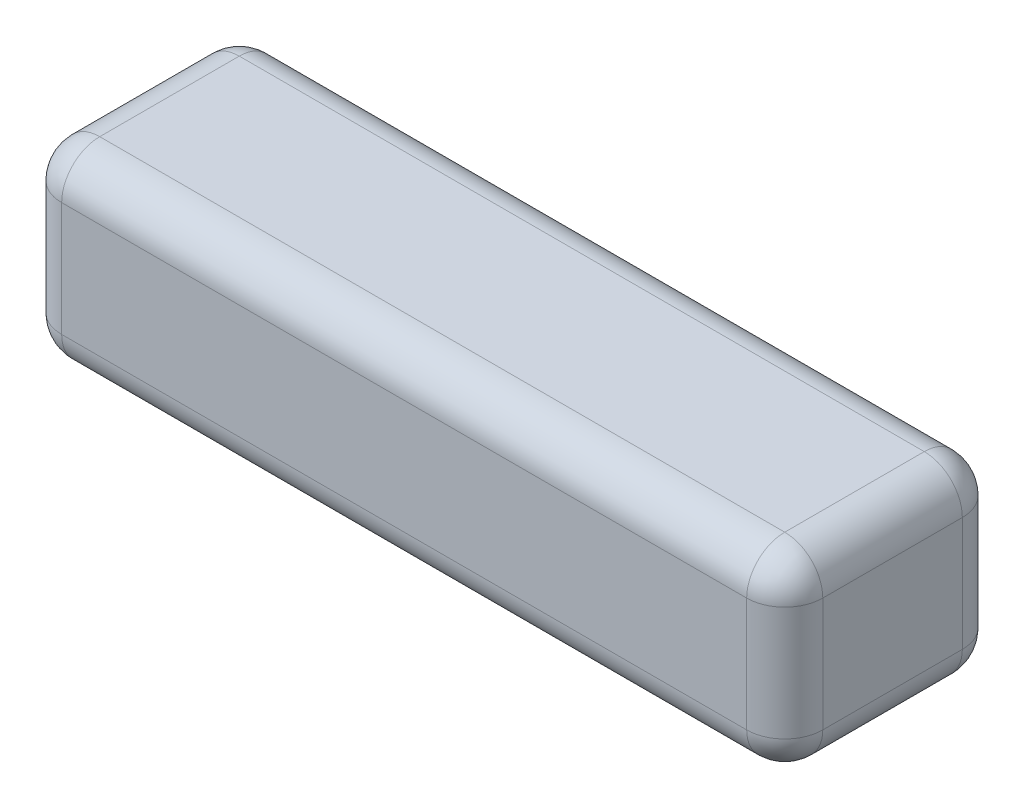
ISO-10303-21;
HEADER;
FILE_DESCRIPTION(('STEP AP214'),'2;1');
FILE_NAME('part.step','',(''),(''),'','','');
FILE_SCHEMA(('AUTOMOTIVE_DESIGN { 1 0 10303 214 1 1 1 1 }'));
ENDSEC;
DATA;
#1=APPLICATION_CONTEXT('core data for automotive mechanical design processes');
#2=APPLICATION_PROTOCOL_DEFINITION('international standard','automotive_design',2000,#1);
#3=PRODUCT_CONTEXT('',#1,'mechanical');
#4=PRODUCT('Part','Part','',(#3));
#5=PRODUCT_RELATED_PRODUCT_CATEGORY('part','',(#4));
#6=PRODUCT_DEFINITION_FORMATION('','',#4);
#7=PRODUCT_DEFINITION_CONTEXT('part definition',#1,'design');
#8=PRODUCT_DEFINITION('design','',#6,#7);
#9=PRODUCT_DEFINITION_SHAPE('','',#8);
#10=(LENGTH_UNIT() NAMED_UNIT(*) SI_UNIT(.MILLI.,.METRE.));
#11=(NAMED_UNIT(*) PLANE_ANGLE_UNIT() SI_UNIT($,.RADIAN.));
#12=(NAMED_UNIT(*) SI_UNIT($,.STERADIAN.) SOLID_ANGLE_UNIT());
#13=UNCERTAINTY_MEASURE_WITH_UNIT(LENGTH_MEASURE(1.E-05),#10,'distance_accuracy_value','');
#14=(GEOMETRIC_REPRESENTATION_CONTEXT(3) GLOBAL_UNCERTAINTY_ASSIGNED_CONTEXT((#13)) GLOBAL_UNIT_ASSIGNED_CONTEXT((#10,
#11,#12)) REPRESENTATION_CONTEXT('',''));
#15=CARTESIAN_POINT('',(0.,0.,0.));
#16=DIRECTION('',(0.,0.,1.));
#17=DIRECTION('',(1.,0.,0.));
#18=AXIS2_PLACEMENT_3D('',#15,#16,#17);
#19=CARTESIAN_POINT('',(30.,15.,-8.5));
#20=DIRECTION('',(-1.,0.,0.));
#21=DIRECTION('',(0.,0.,1.));
#22=AXIS2_PLACEMENT_3D('',#19,#20,#21);
#23=PLANE('',#22);
#24=DIRECTION('',(0.,0.,-1.));
#25=VECTOR('',#24,1.);
#26=CARTESIAN_POINT('',(30.,3.,-8.5));
#27=LINE('',#26,#25);
#28=CARTESIAN_POINT('',(30.,3.,5.5));
#29=VERTEX_POINT('',#28);
#30=CARTESIAN_POINT('',(30.,3.,-5.5));
#31=VERTEX_POINT('',#30);
#32=EDGE_CURVE('E187',#29,#31,#27,.T.);
#33=ORIENTED_EDGE('',*,*,#32,.T.);
#34=DIRECTION('',(0.,-1.,0.));
#35=VECTOR('',#34,1.);
#36=CARTESIAN_POINT('',(30.,15.,-5.5));
#37=LINE('',#36,#35);
#38=CARTESIAN_POINT('',(30.,12.,-5.5));
#39=VERTEX_POINT('',#38);
#40=EDGE_CURVE('E194',#31,#39,#37,.F.);
#41=ORIENTED_EDGE('',*,*,#40,.T.);
#42=DIRECTION('',(0.,0.,-1.));
#43=VECTOR('',#42,1.);
#44=CARTESIAN_POINT('',(30.,12.,8.5));
#45=LINE('',#44,#43);
#46=CARTESIAN_POINT('',(30.,12.,5.5));
#47=VERTEX_POINT('',#46);
#48=EDGE_CURVE('E190',#39,#47,#45,.F.);
#49=ORIENTED_EDGE('',*,*,#48,.T.);
#50=DIRECTION('',(0.,-1.,0.));
#51=VECTOR('',#50,1.);
#52=CARTESIAN_POINT('',(30.,15.,5.5));
#53=LINE('',#52,#51);
#54=EDGE_CURVE('E184',#47,#29,#53,.T.);
#55=ORIENTED_EDGE('',*,*,#54,.T.);
#56=EDGE_LOOP('',(#33,#41,#49,#55));
#57=FACE_BOUND('',#56,.T.);
#58=ADVANCED_FACE('F39',(#57),#23,.F.);
#59=CARTESIAN_POINT('',(-30.,15.,-8.5));
#60=DIRECTION('',(0.,0.,1.));
#61=DIRECTION('',(1.,0.,0.));
#62=AXIS2_PLACEMENT_3D('',#59,#60,#61);
#63=PLANE('',#62);
#64=DIRECTION('',(-1.,0.,0.));
#65=VECTOR('',#64,1.);
#66=CARTESIAN_POINT('',(30.,12.,-8.5));
#67=LINE('',#66,#65);
#68=CARTESIAN_POINT('',(-27.,12.,-8.5));
#69=VERTEX_POINT('',#68);
#70=CARTESIAN_POINT('',(27.,12.,-8.5));
#71=VERTEX_POINT('',#70);
#72=EDGE_CURVE('E213',#69,#71,#67,.F.);
#73=ORIENTED_EDGE('',*,*,#72,.T.);
#74=DIRECTION('',(0.,-1.,0.));
#75=VECTOR('',#74,1.);
#76=CARTESIAN_POINT('',(27.,15.,-8.5));
#77=LINE('',#76,#75);
#78=CARTESIAN_POINT('',(27.,3.,-8.5));
#79=VERTEX_POINT('',#78);
#80=EDGE_CURVE('E220',#71,#79,#77,.T.);
#81=ORIENTED_EDGE('',*,*,#80,.T.);
#82=DIRECTION('',(-1.,0.,0.));
#83=VECTOR('',#82,1.);
#84=CARTESIAN_POINT('',(-30.,3.,-8.5));
#85=LINE('',#84,#83);
#86=CARTESIAN_POINT('',(-27.,3.,-8.5));
#87=VERTEX_POINT('',#86);
#88=EDGE_CURVE('E216',#79,#87,#85,.T.);
#89=ORIENTED_EDGE('',*,*,#88,.T.);
#90=DIRECTION('',(0.,-1.,0.));
#91=VECTOR('',#90,1.);
#92=CARTESIAN_POINT('',(-27.,15.,-8.5));
#93=LINE('',#92,#91);
#94=EDGE_CURVE('E210',#87,#69,#93,.F.);
#95=ORIENTED_EDGE('',*,*,#94,.T.);
#96=EDGE_LOOP('',(#73,#81,#89,#95));
#97=FACE_BOUND('',#96,.T.);
#98=ADVANCED_FACE('F325',(#97),#63,.F.);
#99=CARTESIAN_POINT('',(-30.,15.,-8.5));
#100=DIRECTION('',(1.,0.,0.));
#101=DIRECTION('',(0.,0.,-1.));
#102=AXIS2_PLACEMENT_3D('',#99,#100,#101);
#103=PLANE('',#102);
#104=DIRECTION('',(0.,0.,1.));
#105=VECTOR('',#104,1.);
#106=CARTESIAN_POINT('',(-30.,3.,-8.5));
#107=LINE('',#106,#105);
#108=CARTESIAN_POINT('',(-30.,3.,-5.5));
#109=VERTEX_POINT('',#108);
#110=CARTESIAN_POINT('',(-30.,3.,5.5));
#111=VERTEX_POINT('',#110);
#112=EDGE_CURVE('E176',#109,#111,#107,.T.);
#113=ORIENTED_EDGE('',*,*,#112,.T.);
#114=DIRECTION('',(0.,-1.,0.));
#115=VECTOR('',#114,1.);
#116=CARTESIAN_POINT('',(-30.,15.,5.5));
#117=LINE('',#116,#115);
#118=CARTESIAN_POINT('',(-30.,12.,5.5));
#119=VERTEX_POINT('',#118);
#120=EDGE_CURVE('E181',#111,#119,#117,.F.);
#121=ORIENTED_EDGE('',*,*,#120,.T.);
#122=DIRECTION('',(0.,0.,1.));
#123=VECTOR('',#122,1.);
#124=CARTESIAN_POINT('',(-30.,12.,-8.5));
#125=LINE('',#124,#123);
#126=CARTESIAN_POINT('',(-30.,12.,-5.5));
#127=VERTEX_POINT('',#126);
#128=EDGE_CURVE('E135',#119,#127,#125,.F.);
#129=ORIENTED_EDGE('',*,*,#128,.T.);
#130=DIRECTION('',(0.,-1.,0.));
#131=VECTOR('',#130,1.);
#132=CARTESIAN_POINT('',(-30.,15.,-5.5));
#133=LINE('',#132,#131);
#134=EDGE_CURVE('E170',#127,#109,#133,.T.);
#135=ORIENTED_EDGE('',*,*,#134,.T.);
#136=EDGE_LOOP('',(#113,#121,#129,#135));
#137=FACE_BOUND('',#136,.T.);
#138=ADVANCED_FACE('F360',(#137),#103,.F.);
#139=CARTESIAN_POINT('',(-30.,15.,8.5));
#140=DIRECTION('',(0.,0.,-1.));
#141=DIRECTION('',(-1.,0.,0.));
#142=AXIS2_PLACEMENT_3D('',#139,#140,#141);
#143=PLANE('',#142);
#144=DIRECTION('',(1.,0.,0.));
#145=VECTOR('',#144,1.);
#146=CARTESIAN_POINT('',(-30.,3.,8.5));
#147=LINE('',#146,#145);
#148=CARTESIAN_POINT('',(-27.,3.,8.5));
#149=VERTEX_POINT('',#148);
#150=CARTESIAN_POINT('',(27.,3.,8.5));
#151=VERTEX_POINT('',#150);
#152=EDGE_CURVE('E49',#149,#151,#147,.T.);
#153=ORIENTED_EDGE('',*,*,#152,.T.);
#154=DIRECTION('',(0.,-1.,0.));
#155=VECTOR('',#154,1.);
#156=CARTESIAN_POINT('',(27.,15.,8.5));
#157=LINE('',#156,#155);
#158=CARTESIAN_POINT('',(27.,12.,8.5));
#159=VERTEX_POINT('',#158);
#160=EDGE_CURVE('E11',#151,#159,#157,.F.);
#161=ORIENTED_EDGE('',*,*,#160,.T.);
#162=DIRECTION('',(1.,0.,0.));
#163=VECTOR('',#162,1.);
#164=CARTESIAN_POINT('',(-30.,12.,8.5));
#165=LINE('',#164,#163);
#166=CARTESIAN_POINT('',(-27.,12.,8.5));
#167=VERTEX_POINT('',#166);
#168=EDGE_CURVE('E226',#159,#167,#165,.F.);
#169=ORIENTED_EDGE('',*,*,#168,.T.);
#170=DIRECTION('',(0.,-1.,0.));
#171=VECTOR('',#170,1.);
#172=CARTESIAN_POINT('',(-27.,15.,8.5));
#173=LINE('',#172,#171);
#174=EDGE_CURVE('E223',#167,#149,#173,.T.);
#175=ORIENTED_EDGE('',*,*,#174,.T.);
#176=EDGE_LOOP('',(#153,#161,#169,#175));
#177=FACE_BOUND('',#176,.T.);
#178=ADVANCED_FACE('F545',(#177),#143,.F.);
#179=CARTESIAN_POINT('',(0.,15.,0.));
#180=DIRECTION('',(0.,1.,0.));
#181=DIRECTION('',(0.,0.,1.));
#182=AXIS2_PLACEMENT_3D('',#179,#180,#181);
#183=PLANE('',#182);
#184=DIRECTION('',(0.,0.,-1.));
#185=VECTOR('',#184,1.);
#186=CARTESIAN_POINT('',(27.,15.,-8.5));
#187=LINE('',#186,#185);
#188=CARTESIAN_POINT('',(27.,15.,5.5));
#189=VERTEX_POINT('',#188);
#190=CARTESIAN_POINT('',(27.,15.,-5.5));
#191=VERTEX_POINT('',#190);
#192=EDGE_CURVE('E160',#189,#191,#187,.T.);
#193=ORIENTED_EDGE('',*,*,#192,.T.);
#194=DIRECTION('',(-1.,0.,0.));
#195=VECTOR('',#194,1.);
#196=CARTESIAN_POINT('',(-30.,15.,-5.5));
#197=LINE('',#196,#195);
#198=CARTESIAN_POINT('',(-27.,15.,-5.5));
#199=VERTEX_POINT('',#198);
#200=EDGE_CURVE('E164',#191,#199,#197,.T.);
#201=ORIENTED_EDGE('',*,*,#200,.T.);
#202=DIRECTION('',(0.,0.,1.));
#203=VECTOR('',#202,1.);
#204=CARTESIAN_POINT('',(-27.,15.,8.5));
#205=LINE('',#204,#203);
#206=CARTESIAN_POINT('',(-27.,15.,5.5));
#207=VERTEX_POINT('',#206);
#208=EDGE_CURVE('E133',#199,#207,#205,.T.);
#209=ORIENTED_EDGE('',*,*,#208,.T.);
#210=DIRECTION('',(1.,0.,0.));
#211=VECTOR('',#210,1.);
#212=CARTESIAN_POINT('',(30.,15.,5.5));
#213=LINE('',#212,#211);
#214=EDGE_CURVE('E153',#207,#189,#213,.T.);
#215=ORIENTED_EDGE('',*,*,#214,.T.);
#216=EDGE_LOOP('',(#193,#201,#209,#215));
#217=FACE_BOUND('',#216,.T.);
#218=ADVANCED_FACE('F162',(#217),#183,.T.);
#219=CARTESIAN_POINT('',(0.,0.,0.));
#220=DIRECTION('',(0.,1.,0.));
#221=DIRECTION('',(0.,0.,1.));
#222=AXIS2_PLACEMENT_3D('',#219,#220,#221);
#223=PLANE('',#222);
#224=DIRECTION('',(-1.,0.,0.));
#225=VECTOR('',#224,1.);
#226=CARTESIAN_POINT('',(0.,0.,-5.5));
#227=LINE('',#226,#225);
#228=CARTESIAN_POINT('',(-27.,0.,-5.5));
#229=VERTEX_POINT('',#228);
#230=CARTESIAN_POINT('',(27.,0.,-5.5));
#231=VERTEX_POINT('',#230);
#232=EDGE_CURVE('E203',#229,#231,#227,.F.);
#233=ORIENTED_EDGE('',*,*,#232,.T.);
#234=DIRECTION('',(0.,0.,-1.));
#235=VECTOR('',#234,1.);
#236=CARTESIAN_POINT('',(27.,0.,0.));
#237=LINE('',#236,#235);
#238=CARTESIAN_POINT('',(27.,0.,5.5));
#239=VERTEX_POINT('',#238);
#240=EDGE_CURVE('E206',#231,#239,#237,.F.);
#241=ORIENTED_EDGE('',*,*,#240,.T.);
#242=DIRECTION('',(1.,0.,0.));
#243=VECTOR('',#242,1.);
#244=CARTESIAN_POINT('',(0.,0.,5.5));
#245=LINE('',#244,#243);
#246=CARTESIAN_POINT('',(-27.,0.,5.5));
#247=VERTEX_POINT('',#246);
#248=EDGE_CURVE('E197',#239,#247,#245,.F.);
#249=ORIENTED_EDGE('',*,*,#248,.T.);
#250=DIRECTION('',(0.,0.,1.));
#251=VECTOR('',#250,1.);
#252=CARTESIAN_POINT('',(-27.,0.,0.));
#253=LINE('',#252,#251);
#254=EDGE_CURVE('E200',#247,#229,#253,.F.);
#255=ORIENTED_EDGE('',*,*,#254,.T.);
#256=EDGE_LOOP('',(#233,#241,#249,#255));
#257=FACE_BOUND('',#256,.T.);
#258=ADVANCED_FACE('F342',(#257),#223,.F.);
#259=CARTESIAN_POINT('',(27.,3.,-8.5));
#260=DIRECTION('',(0.,0.,-1.));
#261=DIRECTION('',(-1.,0.,0.));
#262=AXIS2_PLACEMENT_3D('',#259,#260,#261);
#263=CYLINDRICAL_SURFACE('',#262,3.);
#264=CARTESIAN_POINT('',(27.,3.,-5.5));
#265=DIRECTION('',(0.,0.,-1.));
#266=DIRECTION('',(-1.,0.,0.));
#267=AXIS2_PLACEMENT_3D('',#264,#265,#266);
#268=CIRCLE('',#267,3.);
#269=EDGE_CURVE('E43',#31,#231,#268,.T.);
#270=ORIENTED_EDGE('',*,*,#269,.F.);
#271=ORIENTED_EDGE('',*,*,#32,.F.);
#272=CARTESIAN_POINT('',(27.,3.,5.5));
#273=DIRECTION('',(0.,0.,1.));
#274=DIRECTION('',(1.,0.,0.));
#275=AXIS2_PLACEMENT_3D('',#272,#273,#274);
#276=CIRCLE('',#275,3.);
#277=EDGE_CURVE('E301',#239,#29,#276,.T.);
#278=ORIENTED_EDGE('',*,*,#277,.F.);
#279=ORIENTED_EDGE('',*,*,#240,.F.);
#280=EDGE_LOOP('',(#270,#271,#278,#279));
#281=FACE_BOUND('',#280,.T.);
#282=ADVANCED_FACE('F41',(#281),#263,.T.);
#283=CARTESIAN_POINT('',(27.,3.,-5.5));
#284=DIRECTION('',(0.,-1.,0.));
#285=DIRECTION('',(0.,0.,-1.));
#286=AXIS2_PLACEMENT_3D('',#283,#284,#285);
#287=SPHERICAL_SURFACE('',#286,3.);
#288=CARTESIAN_POINT('',(27.,3.,-5.5));
#289=DIRECTION('',(0.,-1.,0.));
#290=DIRECTION('',(0.,0.,-1.));
#291=AXIS2_PLACEMENT_3D('',#288,#289,#290);
#292=CIRCLE('',#291,3.);
#293=EDGE_CURVE('E294',#31,#79,#292,.F.);
#294=ORIENTED_EDGE('',*,*,#293,.F.);
#295=ORIENTED_EDGE('',*,*,#269,.T.);
#296=CARTESIAN_POINT('',(27.,3.,-5.5));
#297=DIRECTION('',(1.,0.,0.));
#298=DIRECTION('',(0.,0.,-1.));
#299=AXIS2_PLACEMENT_3D('',#296,#297,#298);
#300=CIRCLE('',#299,3.);
#301=EDGE_CURVE('E298',#79,#231,#300,.F.);
#302=ORIENTED_EDGE('',*,*,#301,.F.);
#303=EDGE_LOOP('',(#294,#295,#302));
#304=FACE_BOUND('',#303,.T.);
#305=ADVANCED_FACE('F313',(#304),#287,.T.);
#306=CARTESIAN_POINT('',(27.,3.,5.5));
#307=DIRECTION('',(1.,0.,0.));
#308=DIRECTION('',(0.,0.,-1.));
#309=AXIS2_PLACEMENT_3D('',#306,#307,#308);
#310=SPHERICAL_SURFACE('',#309,3.);
#311=CARTESIAN_POINT('',(27.,3.,5.5));
#312=DIRECTION('',(1.,0.,0.));
#313=DIRECTION('',(0.,0.,-1.));
#314=AXIS2_PLACEMENT_3D('',#311,#312,#313);
#315=CIRCLE('',#314,3.);
#316=EDGE_CURVE('E287',#239,#151,#315,.F.);
#317=ORIENTED_EDGE('',*,*,#316,.F.);
#318=ORIENTED_EDGE('',*,*,#277,.T.);
#319=CARTESIAN_POINT('',(27.,3.,5.5));
#320=DIRECTION('',(0.,-1.,0.));
#321=DIRECTION('',(0.,0.,-1.));
#322=AXIS2_PLACEMENT_3D('',#319,#320,#321);
#323=CIRCLE('',#322,3.);
#324=EDGE_CURVE('E291',#151,#29,#323,.F.);
#325=ORIENTED_EDGE('',*,*,#324,.F.);
#326=EDGE_LOOP('',(#317,#318,#325));
#327=FACE_BOUND('',#326,.T.);
#328=ADVANCED_FACE('F511',(#327),#310,.T.);
#329=CARTESIAN_POINT('',(-30.,3.,-5.5));
#330=DIRECTION('',(-1.,0.,0.));
#331=DIRECTION('',(0.,0.,1.));
#332=AXIS2_PLACEMENT_3D('',#329,#330,#331);
#333=CYLINDRICAL_SURFACE('',#332,3.);
#334=ORIENTED_EDGE('',*,*,#301,.T.);
#335=ORIENTED_EDGE('',*,*,#232,.F.);
#336=CARTESIAN_POINT('',(-27.,3.,-5.5));
#337=DIRECTION('',(-1.,0.,0.));
#338=DIRECTION('',(0.,0.,1.));
#339=AXIS2_PLACEMENT_3D('',#336,#337,#338);
#340=CIRCLE('',#339,3.);
#341=EDGE_CURVE('E279',#87,#229,#340,.T.);
#342=ORIENTED_EDGE('',*,*,#341,.F.);
#343=ORIENTED_EDGE('',*,*,#88,.F.);
#344=EDGE_LOOP('',(#334,#335,#342,#343));
#345=FACE_BOUND('',#344,.T.);
#346=ADVANCED_FACE('F321',(#345),#333,.T.);
#347=CARTESIAN_POINT('',(27.,15.,-5.5));
#348=DIRECTION('',(0.,-1.,0.));
#349=DIRECTION('',(0.,0.,-1.));
#350=AXIS2_PLACEMENT_3D('',#347,#348,#349);
#351=CYLINDRICAL_SURFACE('',#350,3.);
#352=ORIENTED_EDGE('',*,*,#293,.T.);
#353=ORIENTED_EDGE('',*,*,#80,.F.);
#354=CARTESIAN_POINT('',(27.,12.,-5.5));
#355=DIRECTION('',(0.,1.,0.));
#356=DIRECTION('',(0.,0.,1.));
#357=AXIS2_PLACEMENT_3D('',#354,#355,#356);
#358=CIRCLE('',#357,3.);
#359=EDGE_CURVE('E275',#39,#71,#358,.T.);
#360=ORIENTED_EDGE('',*,*,#359,.F.);
#361=ORIENTED_EDGE('',*,*,#40,.F.);
#362=EDGE_LOOP('',(#352,#353,#360,#361));
#363=FACE_BOUND('',#362,.T.);
#364=ADVANCED_FACE('F330',(#363),#351,.T.);
#365=CARTESIAN_POINT('',(27.,12.,0.));
#366=DIRECTION('',(0.,0.,1.));
#367=DIRECTION('',(1.,0.,0.));
#368=AXIS2_PLACEMENT_3D('',#365,#366,#367);
#369=CYLINDRICAL_SURFACE('',#368,3.);
#370=CARTESIAN_POINT('',(27.,12.,5.5));
#371=DIRECTION('',(0.,0.,1.));
#372=DIRECTION('',(1.,0.,0.));
#373=AXIS2_PLACEMENT_3D('',#370,#371,#372);
#374=CIRCLE('',#373,3.);
#375=EDGE_CURVE('E267',#47,#189,#374,.T.);
#376=ORIENTED_EDGE('',*,*,#375,.F.);
#377=ORIENTED_EDGE('',*,*,#48,.F.);
#378=CARTESIAN_POINT('',(27.,12.,-5.5));
#379=DIRECTION('',(0.,0.,-1.));
#380=DIRECTION('',(-1.,0.,0.));
#381=AXIS2_PLACEMENT_3D('',#378,#379,#380);
#382=CIRCLE('',#381,3.);
#383=EDGE_CURVE('E271',#191,#39,#382,.T.);
#384=ORIENTED_EDGE('',*,*,#383,.F.);
#385=ORIENTED_EDGE('',*,*,#192,.F.);
#386=EDGE_LOOP('',(#376,#377,#384,#385));
#387=FACE_BOUND('',#386,.T.);
#388=ADVANCED_FACE('F336',(#387),#369,.T.);
#389=CARTESIAN_POINT('',(27.,15.,5.5));
#390=DIRECTION('',(0.,-1.,0.));
#391=DIRECTION('',(0.,0.,-1.));
#392=AXIS2_PLACEMENT_3D('',#389,#390,#391);
#393=CYLINDRICAL_SURFACE('',#392,3.);
#394=ORIENTED_EDGE('',*,*,#324,.T.);
#395=ORIENTED_EDGE('',*,*,#54,.F.);
#396=CARTESIAN_POINT('',(27.,12.,5.5));
#397=DIRECTION('',(0.,1.,0.));
#398=DIRECTION('',(0.,0.,1.));
#399=AXIS2_PLACEMENT_3D('',#396,#397,#398);
#400=CIRCLE('',#399,3.);
#401=EDGE_CURVE('E264',#159,#47,#400,.T.);
#402=ORIENTED_EDGE('',*,*,#401,.F.);
#403=ORIENTED_EDGE('',*,*,#160,.F.);
#404=EDGE_LOOP('',(#394,#395,#402,#403));
#405=FACE_BOUND('',#404,.T.);
#406=ADVANCED_FACE('F340',(#405),#393,.T.);
#407=CARTESIAN_POINT('',(-30.,3.,5.5));
#408=DIRECTION('',(1.,0.,0.));
#409=DIRECTION('',(0.,0.,-1.));
#410=AXIS2_PLACEMENT_3D('',#407,#408,#409);
#411=CYLINDRICAL_SURFACE('',#410,3.);
#412=ORIENTED_EDGE('',*,*,#316,.T.);
#413=ORIENTED_EDGE('',*,*,#152,.F.);
#414=CARTESIAN_POINT('',(-27.,3.,5.5));
#415=DIRECTION('',(-1.,0.,0.));
#416=DIRECTION('',(0.,0.,1.));
#417=AXIS2_PLACEMENT_3D('',#414,#415,#416);
#418=CIRCLE('',#417,3.);
#419=EDGE_CURVE('E260',#247,#149,#418,.T.);
#420=ORIENTED_EDGE('',*,*,#419,.F.);
#421=ORIENTED_EDGE('',*,*,#248,.F.);
#422=EDGE_LOOP('',(#412,#413,#420,#421));
#423=FACE_BOUND('',#422,.T.);
#424=ADVANCED_FACE('F352',(#423),#411,.T.);
#425=CARTESIAN_POINT('',(-27.,3.,-8.5));
#426=DIRECTION('',(0.,0.,1.));
#427=DIRECTION('',(1.,0.,0.));
#428=AXIS2_PLACEMENT_3D('',#425,#426,#427);
#429=CYLINDRICAL_SURFACE('',#428,3.);
#430=CARTESIAN_POINT('',(-27.,3.,-5.5));
#431=DIRECTION('',(0.,0.,-1.));
#432=DIRECTION('',(-1.,0.,0.));
#433=AXIS2_PLACEMENT_3D('',#430,#431,#432);
#434=CIRCLE('',#433,3.);
#435=EDGE_CURVE('E283',#229,#109,#434,.T.);
#436=ORIENTED_EDGE('',*,*,#435,.F.);
#437=ORIENTED_EDGE('',*,*,#254,.F.);
#438=CARTESIAN_POINT('',(-27.,3.,5.5));
#439=DIRECTION('',(0.,0.,1.));
#440=DIRECTION('',(1.,0.,0.));
#441=AXIS2_PLACEMENT_3D('',#438,#439,#440);
#442=CIRCLE('',#441,3.);
#443=EDGE_CURVE('E256',#111,#247,#442,.T.);
#444=ORIENTED_EDGE('',*,*,#443,.F.);
#445=ORIENTED_EDGE('',*,*,#112,.F.);
#446=EDGE_LOOP('',(#436,#437,#444,#445));
#447=FACE_BOUND('',#446,.T.);
#448=ADVANCED_FACE('F347',(#447),#429,.T.);
#449=CARTESIAN_POINT('',(-27.,3.,-5.5));
#450=DIRECTION('',(0.,-1.,0.));
#451=DIRECTION('',(0.,0.,-1.));
#452=AXIS2_PLACEMENT_3D('',#449,#450,#451);
#453=SPHERICAL_SURFACE('',#452,3.);
#454=ORIENTED_EDGE('',*,*,#341,.T.);
#455=ORIENTED_EDGE('',*,*,#435,.T.);
#456=CARTESIAN_POINT('',(-27.,3.,-5.5));
#457=DIRECTION('',(0.,-1.,0.));
#458=DIRECTION('',(0.,0.,-1.));
#459=AXIS2_PLACEMENT_3D('',#456,#457,#458);
#460=CIRCLE('',#459,3.);
#461=EDGE_CURVE('E252',#87,#109,#460,.F.);
#462=ORIENTED_EDGE('',*,*,#461,.F.);
#463=EDGE_LOOP('',(#454,#455,#462));
#464=FACE_BOUND('',#463,.T.);
#465=ADVANCED_FACE('F364',(#464),#453,.T.);
#466=CARTESIAN_POINT('',(27.,12.,-5.5));
#467=DIRECTION('',(1.,0.,0.));
#468=DIRECTION('',(0.,0.,-1.));
#469=AXIS2_PLACEMENT_3D('',#466,#467,#468);
#470=SPHERICAL_SURFACE('',#469,3.);
#471=ORIENTED_EDGE('',*,*,#383,.T.);
#472=ORIENTED_EDGE('',*,*,#359,.T.);
#473=CARTESIAN_POINT('',(27.,12.,-5.5));
#474=DIRECTION('',(1.,0.,0.));
#475=DIRECTION('',(0.,1.,0.));
#476=AXIS2_PLACEMENT_3D('',#473,#474,#475);
#477=CIRCLE('',#476,3.);
#478=EDGE_CURVE('E248',#191,#71,#477,.F.);
#479=ORIENTED_EDGE('',*,*,#478,.F.);
#480=EDGE_LOOP('',(#471,#472,#479));
#481=FACE_BOUND('',#480,.T.);
#482=ADVANCED_FACE('F374',(#481),#470,.T.);
#483=CARTESIAN_POINT('',(27.,12.,5.5));
#484=DIRECTION('',(1.,0.,0.));
#485=DIRECTION('',(0.,0.,-1.));
#486=AXIS2_PLACEMENT_3D('',#483,#484,#485);
#487=SPHERICAL_SURFACE('',#486,3.);
#488=ORIENTED_EDGE('',*,*,#401,.T.);
#489=ORIENTED_EDGE('',*,*,#375,.T.);
#490=CARTESIAN_POINT('',(27.,12.,5.5));
#491=DIRECTION('',(1.,0.,0.));
#492=DIRECTION('',(0.,0.,-1.));
#493=AXIS2_PLACEMENT_3D('',#490,#491,#492);
#494=CIRCLE('',#493,3.);
#495=EDGE_CURVE('E156',#159,#189,#494,.F.);
#496=ORIENTED_EDGE('',*,*,#495,.F.);
#497=EDGE_LOOP('',(#488,#489,#496));
#498=FACE_BOUND('',#497,.T.);
#499=ADVANCED_FACE('F376',(#498),#487,.T.);
#500=CARTESIAN_POINT('',(-27.,3.,5.5));
#501=DIRECTION('',(0.,-1.,0.));
#502=DIRECTION('',(0.,0.,-1.));
#503=AXIS2_PLACEMENT_3D('',#500,#501,#502);
#504=SPHERICAL_SURFACE('',#503,3.);
#505=ORIENTED_EDGE('',*,*,#443,.T.);
#506=ORIENTED_EDGE('',*,*,#419,.T.);
#507=CARTESIAN_POINT('',(-27.,3.,5.5));
#508=DIRECTION('',(0.,-1.,0.));
#509=DIRECTION('',(0.,0.,-1.));
#510=AXIS2_PLACEMENT_3D('',#507,#508,#509);
#511=CIRCLE('',#510,3.);
#512=EDGE_CURVE('E242',#111,#149,#511,.F.);
#513=ORIENTED_EDGE('',*,*,#512,.F.);
#514=EDGE_LOOP('',(#505,#506,#513));
#515=FACE_BOUND('',#514,.T.);
#516=ADVANCED_FACE('F354',(#515),#504,.T.);
#517=CARTESIAN_POINT('',(-27.,15.,-5.5));
#518=DIRECTION('',(0.,-1.,0.));
#519=DIRECTION('',(0.,0.,-1.));
#520=AXIS2_PLACEMENT_3D('',#517,#518,#519);
#521=CYLINDRICAL_SURFACE('',#520,3.);
#522=ORIENTED_EDGE('',*,*,#461,.T.);
#523=ORIENTED_EDGE('',*,*,#134,.F.);
#524=CARTESIAN_POINT('',(-27.,12.,-5.5));
#525=DIRECTION('',(0.,1.,0.));
#526=DIRECTION('',(0.,0.,1.));
#527=AXIS2_PLACEMENT_3D('',#524,#525,#526);
#528=CIRCLE('',#527,3.);
#529=EDGE_CURVE('E238',#69,#127,#528,.T.);
#530=ORIENTED_EDGE('',*,*,#529,.F.);
#531=ORIENTED_EDGE('',*,*,#94,.F.);
#532=EDGE_LOOP('',(#522,#523,#530,#531));
#533=FACE_BOUND('',#532,.T.);
#534=ADVANCED_FACE('F366',(#533),#521,.T.);
#535=CARTESIAN_POINT('',(0.,12.,-5.5));
#536=DIRECTION('',(1.,0.,0.));
#537=DIRECTION('',(0.,0.,-1.));
#538=AXIS2_PLACEMENT_3D('',#535,#536,#537);
#539=CYLINDRICAL_SURFACE('',#538,3.);
#540=ORIENTED_EDGE('',*,*,#478,.T.);
#541=ORIENTED_EDGE('',*,*,#72,.F.);
#542=CARTESIAN_POINT('',(-27.,12.,-5.5));
#543=DIRECTION('',(-1.,0.,0.));
#544=DIRECTION('',(0.,0.,1.));
#545=AXIS2_PLACEMENT_3D('',#542,#543,#544);
#546=CIRCLE('',#545,3.);
#547=EDGE_CURVE('E150',#199,#69,#546,.T.);
#548=ORIENTED_EDGE('',*,*,#547,.F.);
#549=ORIENTED_EDGE('',*,*,#200,.F.);
#550=EDGE_LOOP('',(#540,#541,#548,#549));
#551=FACE_BOUND('',#550,.T.);
#552=ADVANCED_FACE('F372',(#551),#539,.T.);
#553=CARTESIAN_POINT('',(0.,12.,5.5));
#554=DIRECTION('',(-1.,0.,0.));
#555=DIRECTION('',(0.,0.,1.));
#556=AXIS2_PLACEMENT_3D('',#553,#554,#555);
#557=CYLINDRICAL_SURFACE('',#556,3.);
#558=ORIENTED_EDGE('',*,*,#495,.T.);
#559=ORIENTED_EDGE('',*,*,#214,.F.);
#560=CARTESIAN_POINT('',(-27.,12.,5.5));
#561=DIRECTION('',(-1.,0.,0.));
#562=DIRECTION('',(0.,0.,1.));
#563=AXIS2_PLACEMENT_3D('',#560,#561,#562);
#564=CIRCLE('',#563,3.);
#565=EDGE_CURVE('E142',#167,#207,#564,.T.);
#566=ORIENTED_EDGE('',*,*,#565,.F.);
#567=ORIENTED_EDGE('',*,*,#168,.F.);
#568=EDGE_LOOP('',(#558,#559,#566,#567));
#569=FACE_BOUND('',#568,.T.);
#570=ADVANCED_FACE('F154',(#569),#557,.T.);
#571=CARTESIAN_POINT('',(-27.,15.,5.5));
#572=DIRECTION('',(0.,-1.,0.));
#573=DIRECTION('',(0.,0.,-1.));
#574=AXIS2_PLACEMENT_3D('',#571,#572,#573);
#575=CYLINDRICAL_SURFACE('',#574,3.);
#576=ORIENTED_EDGE('',*,*,#512,.T.);
#577=ORIENTED_EDGE('',*,*,#174,.F.);
#578=CARTESIAN_POINT('',(-27.,12.,5.5));
#579=DIRECTION('',(0.,1.,0.));
#580=DIRECTION('',(0.,0.,1.));
#581=AXIS2_PLACEMENT_3D('',#578,#579,#580);
#582=CIRCLE('',#581,3.);
#583=EDGE_CURVE('E146',#119,#167,#582,.T.);
#584=ORIENTED_EDGE('',*,*,#583,.F.);
#585=ORIENTED_EDGE('',*,*,#120,.F.);
#586=EDGE_LOOP('',(#576,#577,#584,#585));
#587=FACE_BOUND('',#586,.T.);
#588=ADVANCED_FACE('F358',(#587),#575,.T.);
#589=CARTESIAN_POINT('',(-27.,12.,-5.5));
#590=DIRECTION('',(0.,0.,-1.));
#591=DIRECTION('',(-1.,0.,0.));
#592=AXIS2_PLACEMENT_3D('',#589,#590,#591);
#593=SPHERICAL_SURFACE('',#592,3.);
#594=ORIENTED_EDGE('',*,*,#547,.T.);
#595=ORIENTED_EDGE('',*,*,#529,.T.);
#596=CARTESIAN_POINT('',(-27.,12.,-5.5));
#597=DIRECTION('',(0.,0.,-1.));
#598=DIRECTION('',(-1.,0.,0.));
#599=AXIS2_PLACEMENT_3D('',#596,#597,#598);
#600=CIRCLE('',#599,3.);
#601=EDGE_CURVE('E139',#199,#127,#600,.F.);
#602=ORIENTED_EDGE('',*,*,#601,.F.);
#603=EDGE_LOOP('',(#594,#595,#602));
#604=FACE_BOUND('',#603,.T.);
#605=ADVANCED_FACE('F370',(#604),#593,.T.);
#606=CARTESIAN_POINT('',(-27.,12.,5.5));
#607=DIRECTION('',(0.,0.,1.));
#608=DIRECTION('',(1.,0.,0.));
#609=AXIS2_PLACEMENT_3D('',#606,#607,#608);
#610=SPHERICAL_SURFACE('',#609,3.);
#611=ORIENTED_EDGE('',*,*,#583,.T.);
#612=ORIENTED_EDGE('',*,*,#565,.T.);
#613=CARTESIAN_POINT('',(-27.,12.,5.5));
#614=DIRECTION('',(0.,0.,1.));
#615=DIRECTION('',(1.,0.,0.));
#616=AXIS2_PLACEMENT_3D('',#613,#614,#615);
#617=CIRCLE('',#616,3.);
#618=EDGE_CURVE('E129',#119,#207,#617,.F.);
#619=ORIENTED_EDGE('',*,*,#618,.F.);
#620=EDGE_LOOP('',(#611,#612,#619));
#621=FACE_BOUND('',#620,.T.);
#622=ADVANCED_FACE('F144',(#621),#610,.T.);
#623=CARTESIAN_POINT('',(-27.,12.,0.));
#624=DIRECTION('',(0.,0.,-1.));
#625=DIRECTION('',(-1.,0.,0.));
#626=AXIS2_PLACEMENT_3D('',#623,#624,#625);
#627=CYLINDRICAL_SURFACE('',#626,3.);
#628=ORIENTED_EDGE('',*,*,#601,.T.);
#629=ORIENTED_EDGE('',*,*,#128,.F.);
#630=ORIENTED_EDGE('',*,*,#618,.T.);
#631=ORIENTED_EDGE('',*,*,#208,.F.);
#632=EDGE_LOOP('',(#628,#629,#630,#631));
#633=FACE_BOUND('',#632,.T.);
#634=ADVANCED_FACE('F131',(#633),#627,.T.);
#635=CLOSED_SHELL('',(#58,#98,#138,#178,#218,#258,#282,#305,#328,#346,#364,#388,#406,#424,#448,
#465,#482,#499,#516,#534,#552,#570,#588,#605,#622,#634));
#636=MANIFOLD_SOLID_BREP('B2',#635);
#637=ADVANCED_BREP_SHAPE_REPRESENTATION('',(#18,#636),#14);
#638=SHAPE_DEFINITION_REPRESENTATION(#9,#637);
ENDSEC;
END-ISO-10303-21;
